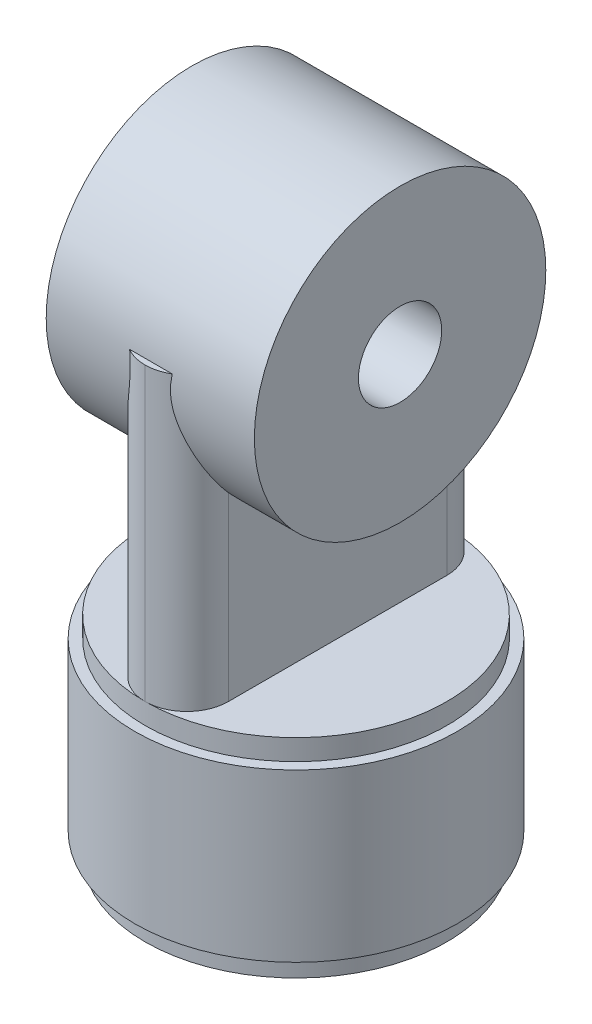
ISO-10303-21;
HEADER;
FILE_DESCRIPTION(('STEP AP214'),'2;1');
FILE_NAME('part.step','',(''),(''),'','','');
FILE_SCHEMA(('AUTOMOTIVE_DESIGN { 1 0 10303 214 1 1 1 1 }'));
ENDSEC;
DATA;
#1=APPLICATION_CONTEXT('core data for automotive mechanical design processes');
#2=APPLICATION_PROTOCOL_DEFINITION('international standard','automotive_design',2000,#1);
#3=PRODUCT_CONTEXT('',#1,'mechanical');
#4=PRODUCT('Part','Part','',(#3));
#5=PRODUCT_RELATED_PRODUCT_CATEGORY('part','',(#4));
#6=PRODUCT_DEFINITION_FORMATION('','',#4);
#7=PRODUCT_DEFINITION_CONTEXT('part definition',#1,'design');
#8=PRODUCT_DEFINITION('design','',#6,#7);
#9=PRODUCT_DEFINITION_SHAPE('','',#8);
#10=(LENGTH_UNIT() NAMED_UNIT(*) SI_UNIT(.MILLI.,.METRE.));
#11=(NAMED_UNIT(*) PLANE_ANGLE_UNIT() SI_UNIT($,.RADIAN.));
#12=(NAMED_UNIT(*) SI_UNIT($,.STERADIAN.) SOLID_ANGLE_UNIT());
#13=UNCERTAINTY_MEASURE_WITH_UNIT(LENGTH_MEASURE(1.E-05),#10,'distance_accuracy_value','');
#14=(GEOMETRIC_REPRESENTATION_CONTEXT(3) GLOBAL_UNCERTAINTY_ASSIGNED_CONTEXT((#13)) GLOBAL_UNIT_ASSIGNED_CONTEXT((#10,
#11,#12)) REPRESENTATION_CONTEXT('',''));
#15=CARTESIAN_POINT('',(0.,0.,0.));
#16=DIRECTION('',(0.,0.,1.));
#17=DIRECTION('',(1.,0.,0.));
#18=AXIS2_PLACEMENT_3D('',#15,#16,#17);
#19=CARTESIAN_POINT('',(2.19715175105949E-05,130.810063129519,-6.0681057722898E-07));
#20=DIRECTION('',(0.,1.,0.));
#21=DIRECTION('',(0.,0.,1.));
#22=AXIS2_PLACEMENT_3D('',#19,#20,#21);
#23=CYLINDRICAL_SURFACE('',#22,9.06059223465878);
#24=CARTESIAN_POINT('',(2.19715175105949E-05,103.065080842823,-6.0681057722898E-07));
#25=DIRECTION('',(0.,1.,0.));
#26=DIRECTION('',(0.,0.,1.));
#27=AXIS2_PLACEMENT_3D('',#24,#25,#26);
#28=CIRCLE('',#27,9.06059223465878);
#29=CARTESIAN_POINT('',(2.19715175105949E-05,103.065080842823,9.0605916278482));
#30=VERTEX_POINT('',#29);
#31=EDGE_CURVE('E254',#30,#30,#28,.T.);
#32=ORIENTED_EDGE('',*,*,#31,.T.);
#33=EDGE_LOOP('',(#32));
#34=FACE_BOUND('',#33,.T.);
#35=CARTESIAN_POINT('',(2.19715175105949E-05,104.315080842823,-6.0681057722898E-07));
#36=DIRECTION('',(0.,1.,0.));
#37=DIRECTION('',(0.,0.,1.));
#38=AXIS2_PLACEMENT_3D('',#35,#36,#37);
#39=CIRCLE('',#38,9.06059223465877);
#40=CARTESIAN_POINT('',(2.19715175123918E-05,104.315080842823,9.0605916278482));
#41=VERTEX_POINT('',#40);
#42=CARTESIAN_POINT('',(2.19715175123918E-05,104.315080842823,-9.06059284146935));
#43=VERTEX_POINT('',#42);
#44=EDGE_CURVE('E258',#41,#43,#39,.T.);
#45=ORIENTED_EDGE('',*,*,#44,.F.);
#46=EDGE_CURVE('E257',#43,#41,#39,.T.);
#47=ORIENTED_EDGE('',*,*,#46,.F.);
#48=EDGE_LOOP('',(#45,#47));
#49=FACE_BOUND('',#48,.T.);
#50=ADVANCED_FACE('F39',(#34,#49),#23,.T.);
#51=CARTESIAN_POINT('',(2.1971517573045E-05,121.815080842823,-6.06810264111393E-07));
#52=DIRECTION('',(0.,1.,0.));
#53=DIRECTION('',(0.,0.,1.));
#54=AXIS2_PLACEMENT_3D('',#51,#52,#53);
#55=PLANE('',#54);
#56=CARTESIAN_POINT('',(2.1971517511896E-05,121.815080842823,6.5605916278482));
#57=DIRECTION('',(0.,1.,0.));
#58=DIRECTION('',(0.,0.,1.));
#59=AXIS2_PLACEMENT_3D('',#56,#57,#58);
#60=CIRCLE('',#59,2.5);
#61=CARTESIAN_POINT('',(-1.27861934600974,121.815080842823,8.70886451114589));
#62=VERTEX_POINT('',#61);
#63=CARTESIAN_POINT('',(2.19715175123918E-05,121.815080842823,9.06059162784815));
#64=VERTEX_POINT('',#63);
#65=EDGE_CURVE('E133',#62,#64,#60,.T.);
#66=ORIENTED_EDGE('',*,*,#65,.T.);
#67=CARTESIAN_POINT('',(2.19715175084265E-05,121.815080842823,6.5605916278482));
#68=DIRECTION('',(0.,1.,0.));
#69=DIRECTION('',(0.,0.,1.));
#70=AXIS2_PLACEMENT_3D('',#67,#68,#69);
#71=CIRCLE('',#70,2.5);
#72=CARTESIAN_POINT('',(1.27866328904476,121.815080842823,8.70886451114589));
#73=VERTEX_POINT('',#72);
#74=EDGE_CURVE('E135',#64,#73,#71,.T.);
#75=ORIENTED_EDGE('',*,*,#74,.T.);
#76=DIRECTION('',(1.,0.,0.));
#77=VECTOR('',#76,1.);
#78=CARTESIAN_POINT('',(-6.24997802848249,121.815080842823,8.70886451114589));
#79=LINE('',#78,#77);
#80=EDGE_CURVE('E111',#73,#62,#79,.F.);
#81=ORIENTED_EDGE('',*,*,#80,.T.);
#82=EDGE_LOOP('',(#66,#75,#81));
#83=FACE_BOUND('',#82,.T.);
#84=ADVANCED_FACE('F263',(#83),#55,.T.);
#85=DIRECTION('',(1.,0.,0.));
#86=VECTOR('',#85,1.);
#87=CARTESIAN_POINT('',(-6.24997802848249,121.815080842823,-8.70886572476704));
#88=LINE('',#87,#86);
#89=CARTESIAN_POINT('',(-1.27861934600974,121.815080842823,-8.70886572476704));
#90=VERTEX_POINT('',#89);
#91=CARTESIAN_POINT('',(1.27866328904476,121.815080842823,-8.70886572476704));
#92=VERTEX_POINT('',#91);
#93=EDGE_CURVE('E208',#90,#92,#88,.T.);
#94=ORIENTED_EDGE('',*,*,#93,.T.);
#95=CARTESIAN_POINT('',(2.19715175084265E-05,121.815080842823,-6.56059284146935));
#96=DIRECTION('',(0.,1.,0.));
#97=DIRECTION('',(0.,0.,1.));
#98=AXIS2_PLACEMENT_3D('',#95,#96,#97);
#99=CIRCLE('',#98,2.5);
#100=CARTESIAN_POINT('',(2.19715175123918E-05,121.815080842823,-9.06059284146934));
#101=VERTEX_POINT('',#100);
#102=EDGE_CURVE('E146',#92,#101,#99,.T.);
#103=ORIENTED_EDGE('',*,*,#102,.T.);
#104=CARTESIAN_POINT('',(2.1971517511896E-05,121.815080842823,-6.56059284146935));
#105=DIRECTION('',(0.,1.,0.));
#106=DIRECTION('',(0.,0.,1.));
#107=AXIS2_PLACEMENT_3D('',#104,#105,#106);
#108=CIRCLE('',#107,2.5);
#109=EDGE_CURVE('E64',#101,#90,#108,.T.);
#110=ORIENTED_EDGE('',*,*,#109,.T.);
#111=EDGE_LOOP('',(#94,#103,#110));
#112=FACE_BOUND('',#111,.T.);
#113=ADVANCED_FACE('F272',(#112),#55,.T.);
#114=CARTESIAN_POINT('',(-9.06057026314126,104.315080842823,-6.0681057722898E-07));
#115=DIRECTION('',(0.,1.,0.));
#116=DIRECTION('',(0.,0.,1.));
#117=AXIS2_PLACEMENT_3D('',#114,#115,#116);
#118=PLANE('',#117);
#119=DIRECTION('',(0.,0.,-1.));
#120=VECTOR('',#119,1.);
#121=CARTESIAN_POINT('',(2.50002197151751,104.315080842823,-8.70886572476704));
#122=LINE('',#121,#120);
#123=CARTESIAN_POINT('',(2.50002197151751,104.315080842823,6.5605916278482));
#124=VERTEX_POINT('',#123);
#125=CARTESIAN_POINT('',(2.50002197151751,104.315080842823,-6.56059284146935));
#126=VERTEX_POINT('',#125);
#127=EDGE_CURVE('E216',#124,#126,#122,.T.);
#128=ORIENTED_EDGE('',*,*,#127,.F.);
#129=CARTESIAN_POINT('',(2.19715175084265E-05,104.315080842823,6.5605916278482));
#130=DIRECTION('',(0.,1.,0.));
#131=DIRECTION('',(0.,0.,1.));
#132=AXIS2_PLACEMENT_3D('',#129,#130,#131);
#133=CIRCLE('',#132,2.5);
#134=EDGE_CURVE('E116',#124,#41,#133,.F.);
#135=ORIENTED_EDGE('',*,*,#134,.T.);
#136=ORIENTED_EDGE('',*,*,#44,.T.);
#137=CARTESIAN_POINT('',(2.19715175084265E-05,104.315080842823,-6.56059284146935));
#138=DIRECTION('',(0.,1.,0.));
#139=DIRECTION('',(0.,0.,1.));
#140=AXIS2_PLACEMENT_3D('',#137,#138,#139);
#141=CIRCLE('',#140,2.5);
#142=EDGE_CURVE('E178',#43,#126,#141,.F.);
#143=ORIENTED_EDGE('',*,*,#142,.T.);
#144=EDGE_LOOP('',(#128,#135,#136,#143));
#145=FACE_BOUND('',#144,.T.);
#146=ADVANCED_FACE('F270',(#145),#118,.T.);
#147=CARTESIAN_POINT('',(2.19715175105949E-05,103.682950843359,-6.0681057722898E-07));
#148=DIRECTION('',(0.,-1.,0.));
#149=DIRECTION('',(0.,0.,-1.));
#150=AXIS2_PLACEMENT_3D('',#147,#148,#149);
#151=PLANE('',#150);
#152=CARTESIAN_POINT('',(2.19715175105949E-05,103.682950843359,-6.0681057722898E-07));
#153=DIRECTION('',(0.,1.,0.));
#154=DIRECTION('',(0.,0.,1.));
#155=AXIS2_PLACEMENT_3D('',#152,#153,#154);
#156=CIRCLE('',#155,8.);
#157=CARTESIAN_POINT('',(2.19715175105949E-05,103.682950843359,7.99999939318942));
#158=VERTEX_POINT('',#157);
#159=EDGE_CURVE('E221',#158,#158,#156,.T.);
#160=ORIENTED_EDGE('',*,*,#159,.F.);
#161=EDGE_LOOP('',(#160));
#162=FACE_BOUND('',#161,.T.);
#163=ADVANCED_FACE('F164',(#162),#151,.T.);
#164=DIRECTION('',(0.,0.,1.));
#165=VECTOR('',#164,1.);
#166=CARTESIAN_POINT('',(-2.49997802848249,104.315080842823,-8.70886572476704));
#167=LINE('',#166,#165);
#168=CARTESIAN_POINT('',(-2.49997802848249,104.315080842823,-6.56059284146935));
#169=VERTEX_POINT('',#168);
#170=CARTESIAN_POINT('',(-2.49997802848249,104.315080842823,6.5605916278482));
#171=VERTEX_POINT('',#170);
#172=EDGE_CURVE('E214',#169,#171,#167,.T.);
#173=ORIENTED_EDGE('',*,*,#172,.F.);
#174=CARTESIAN_POINT('',(2.1971517511896E-05,104.315080842823,-6.56059284146935));
#175=DIRECTION('',(0.,1.,0.));
#176=DIRECTION('',(0.,0.,1.));
#177=AXIS2_PLACEMENT_3D('',#174,#175,#176);
#178=CIRCLE('',#177,2.5);
#179=EDGE_CURVE('E49',#169,#43,#178,.F.);
#180=ORIENTED_EDGE('',*,*,#179,.T.);
#181=ORIENTED_EDGE('',*,*,#46,.T.);
#182=CARTESIAN_POINT('',(2.1971517511896E-05,104.315080842823,6.5605916278482));
#183=DIRECTION('',(0.,1.,0.));
#184=DIRECTION('',(0.,0.,1.));
#185=AXIS2_PLACEMENT_3D('',#182,#183,#184);
#186=CIRCLE('',#185,2.5);
#187=EDGE_CURVE('E115',#41,#171,#186,.F.);
#188=ORIENTED_EDGE('',*,*,#187,.T.);
#189=EDGE_LOOP('',(#173,#180,#181,#188));
#190=FACE_BOUND('',#189,.T.);
#191=ADVANCED_FACE('F266',(#190),#118,.T.);
#192=CARTESIAN_POINT('',(-9.06057026314127,103.065080842823,-6.0681057722898E-07));
#193=DIRECTION('',(0.,1.,0.));
#194=DIRECTION('',(0.,0.,1.));
#195=AXIS2_PLACEMENT_3D('',#192,#193,#194);
#196=PLANE('',#195);
#197=CARTESIAN_POINT('',(2.19715175105949E-05,103.065080842823,-6.0681057722898E-07));
#198=DIRECTION('',(0.,1.,0.));
#199=DIRECTION('',(0.,0.,1.));
#200=AXIS2_PLACEMENT_3D('',#197,#198,#199);
#201=CIRCLE('',#200,9.67634385878391);
#202=CARTESIAN_POINT('',(2.19715175105949E-05,103.065080842823,9.67634325197334));
#203=VERTEX_POINT('',#202);
#204=EDGE_CURVE('E251',#203,#203,#201,.T.);
#205=ORIENTED_EDGE('',*,*,#204,.T.);
#206=EDGE_LOOP('',(#205));
#207=FACE_BOUND('',#206,.T.);
#208=ORIENTED_EDGE('',*,*,#31,.F.);
#209=EDGE_LOOP('',(#208));
#210=FACE_BOUND('',#209,.T.);
#211=ADVANCED_FACE('F280',(#207,#210),#196,.T.);
#212=CARTESIAN_POINT('',(2.19715175105949E-05,130.810063129519,-6.0681057722898E-07));
#213=DIRECTION('',(0.,1.,0.));
#214=DIRECTION('',(0.,0.,1.));
#215=AXIS2_PLACEMENT_3D('',#212,#213,#214);
#216=CYLINDRICAL_SURFACE('',#215,9.67634385878391);
#217=CARTESIAN_POINT('',(2.19715175105949E-05,93.0650808428226,-6.0681057722898E-07));
#218=DIRECTION('',(0.,1.,0.));
#219=DIRECTION('',(0.,0.,1.));
#220=AXIS2_PLACEMENT_3D('',#217,#218,#219);
#221=CIRCLE('',#220,9.67634385878391);
#222=CARTESIAN_POINT('',(2.19715175105949E-05,93.0650808428226,9.67634325197334));
#223=VERTEX_POINT('',#222);
#224=EDGE_CURVE('E248',#223,#223,#221,.T.);
#225=ORIENTED_EDGE('',*,*,#224,.T.);
#226=EDGE_LOOP('',(#225));
#227=FACE_BOUND('',#226,.T.);
#228=ORIENTED_EDGE('',*,*,#204,.F.);
#229=EDGE_LOOP('',(#228));
#230=FACE_BOUND('',#229,.T.);
#231=ADVANCED_FACE('F289',(#227,#230),#216,.T.);
#232=CARTESIAN_POINT('',(-9.06057026314126,93.0650808428226,-6.0681057722898E-07));
#233=DIRECTION('',(0.,-1.,0.));
#234=DIRECTION('',(0.,0.,-1.));
#235=AXIS2_PLACEMENT_3D('',#232,#233,#234);
#236=PLANE('',#235);
#237=CARTESIAN_POINT('',(2.19715175105949E-05,93.0650808428226,-6.0681057722898E-07));
#238=DIRECTION('',(0.,1.,0.));
#239=DIRECTION('',(0.,0.,1.));
#240=AXIS2_PLACEMENT_3D('',#237,#238,#239);
#241=CIRCLE('',#240,9.06059223465877);
#242=CARTESIAN_POINT('',(2.19715175105949E-05,93.0650808428226,9.0605916278482));
#243=VERTEX_POINT('',#242);
#244=EDGE_CURVE('E245',#243,#243,#241,.T.);
#245=ORIENTED_EDGE('',*,*,#244,.T.);
#246=EDGE_LOOP('',(#245));
#247=FACE_BOUND('',#246,.T.);
#248=ORIENTED_EDGE('',*,*,#224,.F.);
#249=EDGE_LOOP('',(#248));
#250=FACE_BOUND('',#249,.T.);
#251=ADVANCED_FACE('F293',(#247,#250),#236,.T.);
#252=CARTESIAN_POINT('',(2.19715175105949E-05,130.810063129519,-6.0681057722898E-07));
#253=DIRECTION('',(0.,1.,0.));
#254=DIRECTION('',(0.,0.,1.));
#255=AXIS2_PLACEMENT_3D('',#252,#253,#254);
#256=CYLINDRICAL_SURFACE('',#255,9.06059223465877);
#257=CARTESIAN_POINT('',(2.19715175105949E-05,91.8150808428226,-6.0681057722898E-07));
#258=DIRECTION('',(0.,1.,0.));
#259=DIRECTION('',(0.,0.,1.));
#260=AXIS2_PLACEMENT_3D('',#257,#258,#259);
#261=CIRCLE('',#260,9.06059223465877);
#262=CARTESIAN_POINT('',(2.19715175105949E-05,91.8150808428226,9.0605916278482));
#263=VERTEX_POINT('',#262);
#264=EDGE_CURVE('E242',#263,#263,#261,.T.);
#265=ORIENTED_EDGE('',*,*,#264,.T.);
#266=EDGE_LOOP('',(#265));
#267=FACE_BOUND('',#266,.T.);
#268=ORIENTED_EDGE('',*,*,#244,.F.);
#269=EDGE_LOOP('',(#268));
#270=FACE_BOUND('',#269,.T.);
#271=ADVANCED_FACE('F297',(#267,#270),#256,.T.);
#272=CARTESIAN_POINT('',(-1.24997802848248,91.8150808428226,-6.0681057722898E-07));
#273=DIRECTION('',(0.,-1.,0.));
#274=DIRECTION('',(0.,0.,-1.));
#275=AXIS2_PLACEMENT_3D('',#272,#273,#274);
#276=PLANE('',#275);
#277=CARTESIAN_POINT('',(2.19715175105949E-05,91.8150808428226,-6.0681057722898E-07));
#278=DIRECTION('',(0.,1.,0.));
#279=DIRECTION('',(0.,0.,1.));
#280=AXIS2_PLACEMENT_3D('',#277,#278,#279);
#281=CIRCLE('',#280,1.24999999999999);
#282=CARTESIAN_POINT('',(2.19715175105949E-05,91.8150808428226,1.24999939318942));
#283=VERTEX_POINT('',#282);
#284=EDGE_CURVE('E239',#283,#283,#281,.T.);
#285=ORIENTED_EDGE('',*,*,#284,.T.);
#286=EDGE_LOOP('',(#285));
#287=FACE_BOUND('',#286,.T.);
#288=ORIENTED_EDGE('',*,*,#264,.F.);
#289=EDGE_LOOP('',(#288));
#290=FACE_BOUND('',#289,.T.);
#291=ADVANCED_FACE('F301',(#287,#290),#276,.T.);
#292=CARTESIAN_POINT('',(2.19715175105949E-05,130.810063129519,-6.0681057722898E-07));
#293=DIRECTION('',(0.,1.,0.));
#294=DIRECTION('',(0.,0.,1.));
#295=AXIS2_PLACEMENT_3D('',#292,#293,#294);
#296=CYLINDRICAL_SURFACE('',#295,1.25);
#297=CARTESIAN_POINT('',(2.19715175105949E-05,94.8129625902348,-6.0681057722898E-07));
#298=DIRECTION('',(0.,1.,0.));
#299=DIRECTION('',(0.,0.,1.));
#300=AXIS2_PLACEMENT_3D('',#297,#298,#299);
#301=CIRCLE('',#300,1.25);
#302=CARTESIAN_POINT('',(2.19715175105949E-05,94.8129625902348,1.24999939318942));
#303=VERTEX_POINT('',#302);
#304=EDGE_CURVE('E236',#303,#303,#301,.T.);
#305=ORIENTED_EDGE('',*,*,#304,.T.);
#306=EDGE_LOOP('',(#305));
#307=FACE_BOUND('',#306,.T.);
#308=ORIENTED_EDGE('',*,*,#284,.F.);
#309=EDGE_LOOP('',(#308));
#310=FACE_BOUND('',#309,.T.);
#311=ADVANCED_FACE('F305',(#307,#310),#296,.F.);
#312=CARTESIAN_POINT('',(-6.24997802848249,94.8129625902348,-6.0681057722898E-07));
#313=DIRECTION('',(0.,1.,0.));
#314=DIRECTION('',(0.,0.,1.));
#315=AXIS2_PLACEMENT_3D('',#312,#313,#314);
#316=PLANE('',#315);
#317=CARTESIAN_POINT('',(2.19715175105949E-05,94.8129625902348,-6.0681057722898E-07));
#318=DIRECTION('',(0.,1.,0.));
#319=DIRECTION('',(0.,0.,1.));
#320=AXIS2_PLACEMENT_3D('',#317,#318,#319);
#321=CIRCLE('',#320,6.25);
#322=CARTESIAN_POINT('',(2.19715175105949E-05,94.8129625902348,6.24999939318942));
#323=VERTEX_POINT('',#322);
#324=EDGE_CURVE('E233',#323,#323,#321,.T.);
#325=ORIENTED_EDGE('',*,*,#324,.T.);
#326=EDGE_LOOP('',(#325));
#327=FACE_BOUND('',#326,.T.);
#328=ORIENTED_EDGE('',*,*,#304,.F.);
#329=EDGE_LOOP('',(#328));
#330=FACE_BOUND('',#329,.T.);
#331=ADVANCED_FACE('F309',(#327,#330),#316,.T.);
#332=CARTESIAN_POINT('',(2.19715175105949E-05,130.810063129519,-6.0681057722898E-07));
#333=DIRECTION('',(0.,1.,0.));
#334=DIRECTION('',(0.,0.,1.));
#335=AXIS2_PLACEMENT_3D('',#332,#333,#334);
#336=CYLINDRICAL_SURFACE('',#335,6.25);
#337=CARTESIAN_POINT('',(2.19715175105949E-05,95.5650808428226,-6.0681057722898E-07));
#338=DIRECTION('',(0.,1.,0.));
#339=DIRECTION('',(0.,0.,1.));
#340=AXIS2_PLACEMENT_3D('',#337,#338,#339);
#341=CIRCLE('',#340,6.25);
#342=CARTESIAN_POINT('',(2.19715175105949E-05,95.5650808428226,6.24999939318942));
#343=VERTEX_POINT('',#342);
#344=EDGE_CURVE('E230',#343,#343,#341,.T.);
#345=ORIENTED_EDGE('',*,*,#344,.T.);
#346=EDGE_LOOP('',(#345));
#347=FACE_BOUND('',#346,.T.);
#348=ORIENTED_EDGE('',*,*,#324,.F.);
#349=EDGE_LOOP('',(#348));
#350=FACE_BOUND('',#349,.T.);
#351=ADVANCED_FACE('F313',(#347,#350),#336,.F.);
#352=CARTESIAN_POINT('',(-7.49997802848249,95.5650808428226,-6.0681057722898E-07));
#353=DIRECTION('',(0.,1.,0.));
#354=DIRECTION('',(0.,0.,1.));
#355=AXIS2_PLACEMENT_3D('',#352,#353,#354);
#356=PLANE('',#355);
#357=CARTESIAN_POINT('',(2.19715175105949E-05,95.5650808428226,-6.0681057722898E-07));
#358=DIRECTION('',(0.,1.,0.));
#359=DIRECTION('',(0.,0.,1.));
#360=AXIS2_PLACEMENT_3D('',#357,#358,#359);
#361=CIRCLE('',#360,7.5);
#362=CARTESIAN_POINT('',(2.19715175105949E-05,95.5650808428226,7.49999939318942));
#363=VERTEX_POINT('',#362);
#364=EDGE_CURVE('E227',#363,#363,#361,.T.);
#365=ORIENTED_EDGE('',*,*,#364,.T.);
#366=EDGE_LOOP('',(#365));
#367=FACE_BOUND('',#366,.T.);
#368=ORIENTED_EDGE('',*,*,#344,.F.);
#369=EDGE_LOOP('',(#368));
#370=FACE_BOUND('',#369,.T.);
#371=ADVANCED_FACE('F317',(#367,#370),#356,.T.);
#372=CARTESIAN_POINT('',(2.19715175105949E-05,96.0650808428226,-6.0681057722898E-07));
#373=DIRECTION('',(0.,1.,0.));
#374=DIRECTION('',(0.,0.,1.));
#375=AXIS2_PLACEMENT_3D('',#372,#373,#374);
#376=TOROIDAL_SURFACE('',#375,7.5,0.5);
#377=CARTESIAN_POINT('',(2.19715175105949E-05,96.0650808428226,-6.0681057722898E-07));
#378=DIRECTION('',(0.,1.,0.));
#379=DIRECTION('',(0.,0.,1.));
#380=AXIS2_PLACEMENT_3D('',#377,#378,#379);
#381=CIRCLE('',#380,8.);
#382=CARTESIAN_POINT('',(2.19715175105949E-05,96.0650808428226,7.99999939318942));
#383=VERTEX_POINT('',#382);
#384=EDGE_CURVE('E224',#383,#383,#381,.T.);
#385=ORIENTED_EDGE('',*,*,#384,.T.);
#386=EDGE_LOOP('',(#385));
#387=FACE_BOUND('',#386,.T.);
#388=ORIENTED_EDGE('',*,*,#364,.F.);
#389=EDGE_LOOP('',(#388));
#390=FACE_BOUND('',#389,.T.);
#391=ADVANCED_FACE('F321',(#387,#390),#376,.F.);
#392=CARTESIAN_POINT('',(2.19715175105949E-05,130.810063129519,-6.0681057722898E-07));
#393=DIRECTION('',(0.,1.,0.));
#394=DIRECTION('',(0.,0.,1.));
#395=AXIS2_PLACEMENT_3D('',#392,#393,#394);
#396=CYLINDRICAL_SURFACE('',#395,8.);
#397=ORIENTED_EDGE('',*,*,#159,.T.);
#398=EDGE_LOOP('',(#397));
#399=FACE_BOUND('',#398,.T.);
#400=ORIENTED_EDGE('',*,*,#384,.F.);
#401=EDGE_LOOP('',(#400));
#402=FACE_BOUND('',#401,.T.);
#403=ADVANCED_FACE('F325',(#399,#402),#396,.F.);
#404=CARTESIAN_POINT('',(-2.49997802848249,121.815080842823,-8.70886572476704));
#405=DIRECTION('',(1.,0.,0.));
#406=DIRECTION('',(0.,0.,-1.));
#407=AXIS2_PLACEMENT_3D('',#404,#405,#406);
#408=PLANE('',#407);
#409=ORIENTED_EDGE('',*,*,#172,.T.);
#410=DIRECTION('',(0.,-1.,0.));
#411=VECTOR('',#410,1.);
#412=CARTESIAN_POINT('',(-2.49997802848249,120.120184554266,6.5605916278482));
#413=LINE('',#412,#411);
#414=CARTESIAN_POINT('',(-2.49997802848249,115.177889221452,6.5605916278482));
#415=VERTEX_POINT('',#414);
#416=EDGE_CURVE('E143',#171,#415,#413,.F.);
#417=ORIENTED_EDGE('',*,*,#416,.T.);
#418=CARTESIAN_POINT('',(-2.49997802848249,120.967632698544,-6.0681057722898E-07));
#419=DIRECTION('',(1.,0.,0.));
#420=DIRECTION('',(0.,0.,-1.));
#421=AXIS2_PLACEMENT_3D('',#418,#419,#420);
#422=CIRCLE('',#421,8.75);
#423=CARTESIAN_POINT('',(-2.49997802848249,115.177889221452,-6.56059284146935));
#424=VERTEX_POINT('',#423);
#425=EDGE_CURVE('E127',#424,#415,#422,.F.);
#426=ORIENTED_EDGE('',*,*,#425,.F.);
#427=DIRECTION('',(0.,-1.,0.));
#428=VECTOR('',#427,1.);
#429=CARTESIAN_POINT('',(-2.49997802848249,104.315080842823,-6.56059284146935));
#430=LINE('',#429,#428);
#431=EDGE_CURVE('E141',#424,#169,#430,.T.);
#432=ORIENTED_EDGE('',*,*,#431,.T.);
#433=EDGE_LOOP('',(#409,#417,#426,#432));
#434=FACE_BOUND('',#433,.T.);
#435=ADVANCED_FACE('F211',(#434),#408,.F.);
#436=CARTESIAN_POINT('',(2.50002197151751,121.815080842823,-8.70886572476704));
#437=DIRECTION('',(-1.,0.,0.));
#438=DIRECTION('',(0.,0.,1.));
#439=AXIS2_PLACEMENT_3D('',#436,#437,#438);
#440=PLANE('',#439);
#441=CARTESIAN_POINT('',(2.50002197151751,120.967632698544,-6.0681057722898E-07));
#442=DIRECTION('',(-1.,0.,0.));
#443=DIRECTION('',(0.,0.,1.));
#444=AXIS2_PLACEMENT_3D('',#441,#442,#443);
#445=CIRCLE('',#444,8.75);
#446=CARTESIAN_POINT('',(2.50002197151751,115.177889221452,6.5605916278482));
#447=VERTEX_POINT('',#446);
#448=CARTESIAN_POINT('',(2.50002197151751,115.177889221452,-6.56059284146935));
#449=VERTEX_POINT('',#448);
#450=EDGE_CURVE('E109',#447,#449,#445,.F.);
#451=ORIENTED_EDGE('',*,*,#450,.F.);
#452=DIRECTION('',(0.,-1.,0.));
#453=VECTOR('',#452,1.);
#454=CARTESIAN_POINT('',(2.50002197151751,104.315080842823,6.5605916278482));
#455=LINE('',#454,#453);
#456=EDGE_CURVE('E123',#447,#124,#455,.T.);
#457=ORIENTED_EDGE('',*,*,#456,.T.);
#458=ORIENTED_EDGE('',*,*,#127,.T.);
#459=DIRECTION('',(0.,-1.,0.));
#460=VECTOR('',#459,1.);
#461=CARTESIAN_POINT('',(2.50002197151751,120.120184554266,-6.56059284146935));
#462=LINE('',#461,#460);
#463=EDGE_CURVE('E126',#126,#449,#462,.F.);
#464=ORIENTED_EDGE('',*,*,#463,.T.);
#465=EDGE_LOOP('',(#451,#457,#458,#464));
#466=FACE_BOUND('',#465,.T.);
#467=ADVANCED_FACE('F121',(#466),#440,.F.);
#468=CARTESIAN_POINT('',(-6.24997802848249,120.967632698544,-6.0681057722898E-07));
#469=DIRECTION('',(1.,0.,0.));
#470=DIRECTION('',(0.,0.,-1.));
#471=AXIS2_PLACEMENT_3D('',#468,#469,#470);
#472=CYLINDRICAL_SURFACE('',#471,8.75);
#473=ORIENTED_EDGE('',*,*,#80,.F.);
#474=CARTESIAN_POINT('',(1.27866328904476,121.815080842823,8.70886451114589));
#475=CARTESIAN_POINT('',(1.26150703257347,121.710550839917,8.71904538902356));
#476=CARTESIAN_POINT('',(1.24709243268614,121.605340889017,8.72737436995917));
#477=CARTESIAN_POINT('',(1.22449039870761,121.394009454449,8.74024369353909));
#478=CARTESIAN_POINT('',(1.2163042423246,121.287887788264,8.744783258838));
#479=CARTESIAN_POINT('',(1.20699172598372,121.07706122034,8.74993973790576));
#480=CARTESIAN_POINT('',(1.2057458641021,120.97236350907,8.7506230534774));
#481=CARTESIAN_POINT('',(1.21006993790728,120.763188066516,8.74823610686625));
#482=CARTESIAN_POINT('',(1.2156383427716,120.658710291104,8.74516668773402));
#483=CARTESIAN_POINT('',(1.2383122739855,120.389374738023,8.73243576350212));
#484=CARTESIAN_POINT('',(1.2602693285585,120.225048042336,8.71996356335069));
#485=CARTESIAN_POINT('',(1.3165597617011,119.899417956044,8.68609754923238));
#486=CARTESIAN_POINT('',(1.3509071083789,119.738118194603,8.66469366190422));
#487=CARTESIAN_POINT('',(1.42811949264967,119.41713827578,8.61308141583737));
#488=CARTESIAN_POINT('',(1.47107425707842,119.257495576774,8.58277859564742));
#489=CARTESIAN_POINT('',(1.56161038969089,118.941478398993,8.51371475592465));
#490=CARTESIAN_POINT('',(1.60919055699109,118.785103084655,8.4749559285727));
#491=CARTESIAN_POINT('',(1.73112300385255,118.395434834299,8.36693853737342));
#492=CARTESIAN_POINT('',(1.80664529796582,118.163997052989,8.29225164534961));
#493=CARTESIAN_POINT('',(1.9545287861612,117.707073681455,8.12345739262519));
#494=CARTESIAN_POINT('',(2.02688786461134,117.4815921136,8.02933726823139));
#495=CARTESIAN_POINT('',(2.16181428003195,117.039030308484,7.82225685672544));
#496=CARTESIAN_POINT('',(2.22446491471983,116.821892197558,7.7094762577917));
#497=CARTESIAN_POINT('',(2.33483842072995,116.395210485303,7.4643038371813));
#498=CARTESIAN_POINT('',(2.38258149443693,116.185656949226,7.33193891764383));
#499=CARTESIAN_POINT('',(2.44449573400818,115.842400578723,7.09386164888935));
#500=CARTESIAN_POINT('',(2.46453239790909,115.706121957511,6.99341073124019));
#501=CARTESIAN_POINT('',(2.48535712474847,115.505309135044,6.83613934573699));
#502=CARTESIAN_POINT('',(2.49076244991596,115.438785346256,6.78245153930781));
#503=CARTESIAN_POINT('',(2.49809358458303,115.307197614692,6.6730278618254));
#504=CARTESIAN_POINT('',(2.5000177522008,115.242134375063,6.61729103699443));
#505=CARTESIAN_POINT('',(2.50002197151751,115.177889221452,6.5605916278482));
#506=B_SPLINE_CURVE_WITH_KNOTS('',3,(#474,#475,#476,#477,#478,#479,#480,#481,#482,#483,#484,
#485,#486,#487,#488,#489,#490,#491,#492,#493,#494,#495,#496,#497,#498,#499,#500,#501,#502,#503,
#504,#505),.UNSPECIFIED.,.F.,.F.,(4,2,2,2,2,2,2,2,2,2,2,2,2,2,2,4),(0.,0.319271040867784,
0.638607559622306,0.952428157329494,1.26617826829766,1.76397033380798,2.26232534449227,
2.76617434894583,3.26989288775337,4.03298508704667,4.79658008667007,5.55320970660148,
6.30880946400289,6.81957286020573,7.07644402380242,7.33343630867609),.UNSPECIFIED.);
#507=EDGE_CURVE('E105',#73,#447,#506,.T.);
#508=ORIENTED_EDGE('',*,*,#507,.T.);
#509=ORIENTED_EDGE('',*,*,#450,.T.);
#510=CARTESIAN_POINT('',(2.50002197151751,115.177889221452,-6.56059284146935));
#511=CARTESIAN_POINT('',(2.50001891961953,115.237445363057,-6.61315313170282));
#512=CARTESIAN_POINT('',(2.49836485114013,115.297704014236,-6.66488696110784));
#513=CARTESIAN_POINT('',(2.49204075251503,115.41949406742,-6.7666058193505));
#514=CARTESIAN_POINT('',(2.48737170138551,115.481025050001,-6.81659141031869));
#515=CARTESIAN_POINT('',(2.46929449621143,115.667126039202,-6.96362637056656));
#516=CARTESIAN_POINT('',(2.45181385710471,115.793455081379,-7.05797524167562));
#517=CARTESIAN_POINT('',(2.40821913866391,116.048716380623,-7.2381602979014));
#518=CARTESIAN_POINT('',(2.38218845826318,116.17761261549,-7.32406869130579));
#519=CARTESIAN_POINT('',(2.32315628315903,116.438673196923,-7.48831313829099));
#520=CARTESIAN_POINT('',(2.29015053703906,116.570839493067,-7.56664453092468));
#521=CARTESIAN_POINT('',(2.19744814859438,116.917489265755,-7.76005090115284));
#522=CARTESIAN_POINT('',(2.13355780557357,117.134146265834,-7.86924572185594));
#523=CARTESIAN_POINT('',(1.99766683469561,117.573643698668,-8.06855957385786));
#524=CARTESIAN_POINT('',(1.92566098569901,117.7964880418,-8.15866621614171));
#525=CARTESIAN_POINT('',(1.7789914427082,118.249134305692,-8.32047654484147));
#526=CARTESIAN_POINT('',(1.70431748677761,118.478962430357,-8.39209787907028));
#527=CARTESIAN_POINT('',(1.59613228108453,118.82853717415,-8.48535654672561));
#528=CARTESIAN_POINT('',(1.56071911579067,118.945828396014,-8.5140734752973));
#529=CARTESIAN_POINT('',(1.49238661372399,119.18218656209,-8.56676039100951));
#530=CARTESIAN_POINT('',(1.45946785202383,119.301253908251,-8.59072928555738));
#531=CARTESIAN_POINT('',(1.3601549424599,119.686371086927,-8.65986543902215));
#532=CARTESIAN_POINT('',(1.30128602303873,119.956450053646,-8.69572210286042));
#533=CARTESIAN_POINT('',(1.24199251807143,120.366507612698,-8.73039679330817));
#534=CARTESIAN_POINT('',(1.22706482981673,120.50358869376,-8.73877323389427));
#535=CARTESIAN_POINT('',(1.20865973564387,120.77873279902,-8.74904271705933));
#536=CARTESIAN_POINT('',(1.20517587331218,120.916795225478,-8.75093941542374));
#537=CARTESIAN_POINT('',(1.20995186334881,121.181899546943,-8.748301914675));
#538=CARTESIAN_POINT('',(1.2173192723842,121.308963291298,-8.74425648754116));
#539=CARTESIAN_POINT('',(1.23533162716134,121.499047024728,-8.73408147987332));
#540=CARTESIAN_POINT('',(1.24253159397351,121.562533020653,-8.72998480738547));
#541=CARTESIAN_POINT('',(1.25905663086452,121.689113089584,-8.72043593755534));
#542=CARTESIAN_POINT('',(1.26838125957446,121.752207241198,-8.71498402172461));
#543=CARTESIAN_POINT('',(1.278663289045,121.815080842823,-8.70886572476704));
#544=B_SPLINE_CURVE_WITH_KNOTS('',3,(#510,#511,#512,#513,#514,#515,#516,#517,#518,#519,#520,
#521,#522,#523,#524,#525,#526,#527,#528,#529,#530,#531,#532,#533,#534,#535,#536,#537,#538,#539,
#540,#541,#542,#543),.UNSPECIFIED.,.F.,.F.,(4,2,2,2,2,2,2,2,2,2,2,2,2,2,2,2,4),(0.,
0.23823942909357,0.476401536665596,0.951725538400149,1.42254437377345,1.89365101290562,
2.64516050189752,3.39715626716608,4.1524465026146,4.52984503638366,4.90733031449439,
5.7402133140002,6.15412328521798,6.5677996952676,6.9492968966235,7.14132580989255,
7.33331486814192),.UNSPECIFIED.);
#545=EDGE_CURVE('E57',#449,#92,#544,.T.);
#546=ORIENTED_EDGE('',*,*,#545,.T.);
#547=ORIENTED_EDGE('',*,*,#93,.F.);
#548=CARTESIAN_POINT('',(-1.27861934600974,121.815080842823,-8.70886572476704));
#549=CARTESIAN_POINT('',(-1.26146308953845,121.710550839917,-8.71904660264471));
#550=CARTESIAN_POINT('',(-1.24704848965112,121.605340889017,-8.72737558358032));
#551=CARTESIAN_POINT('',(-1.22444645567259,121.394009454449,-8.74024490716024));
#552=CARTESIAN_POINT('',(-1.21626029928958,121.287887788264,-8.74478447245916));
#553=CARTESIAN_POINT('',(-1.20694778294869,121.07706122034,-8.74994095152691));
#554=CARTESIAN_POINT('',(-1.20570192106708,120.97236350907,-8.75062426709856));
#555=CARTESIAN_POINT('',(-1.21002599487226,120.763188066516,-8.74823732048741));
#556=CARTESIAN_POINT('',(-1.21559439973658,120.658710291104,-8.74516790135518));
#557=CARTESIAN_POINT('',(-1.23826833095047,120.389374738023,-8.73243697712328));
#558=CARTESIAN_POINT('',(-1.26022538552348,120.225048042336,-8.71996477697184));
#559=CARTESIAN_POINT('',(-1.31651581866608,119.899417956044,-8.68609876285353));
#560=CARTESIAN_POINT('',(-1.35086316534388,119.738118194603,-8.66469487552538));
#561=CARTESIAN_POINT('',(-1.42807554961464,119.41713827578,-8.61308262945853));
#562=CARTESIAN_POINT('',(-1.47103031404339,119.257495576774,-8.58277980926858));
#563=CARTESIAN_POINT('',(-1.56156644665586,118.941478398993,-8.51371596954582));
#564=CARTESIAN_POINT('',(-1.60914661395606,118.785103084656,-8.47495714219386));
#565=CARTESIAN_POINT('',(-1.73107906081753,118.395434834299,-8.36693975099458));
#566=CARTESIAN_POINT('',(-1.8066013549308,118.163997052989,-8.29225285897077));
#567=CARTESIAN_POINT('',(-1.95448484312617,117.707073681455,-8.12345860624635));
#568=CARTESIAN_POINT('',(-2.02684392157632,117.4815921136,-8.02933848185254));
#569=CARTESIAN_POINT('',(-2.16177033699693,117.039030308484,-7.82225807034659));
#570=CARTESIAN_POINT('',(-2.22442097168481,116.821892197558,-7.70947747141285));
#571=CARTESIAN_POINT('',(-2.33479447769493,116.395210485303,-7.46430505080245));
#572=CARTESIAN_POINT('',(-2.38253755140191,116.185656949226,-7.33194013126499));
#573=CARTESIAN_POINT('',(-2.44445179097315,115.842400578723,-7.09386286251051));
#574=CARTESIAN_POINT('',(-2.46448845487407,115.706121957511,-6.99341194486134));
#575=CARTESIAN_POINT('',(-2.48531318171345,115.505309135044,-6.83614055935815));
#576=CARTESIAN_POINT('',(-2.49071850688094,115.438785346256,-6.78245275292897));
#577=CARTESIAN_POINT('',(-2.49804964154801,115.307197614692,-6.67302907544656));
#578=CARTESIAN_POINT('',(-2.49997380916578,115.242134375063,-6.61729225061558));
#579=CARTESIAN_POINT('',(-2.49997802848249,115.177889221452,-6.56059284146935));
#580=B_SPLINE_CURVE_WITH_KNOTS('',3,(#548,#549,#550,#551,#552,#553,#554,#555,#556,#557,#558,
#559,#560,#561,#562,#563,#564,#565,#566,#567,#568,#569,#570,#571,#572,#573,#574,#575,#576,#577,
#578,#579),.UNSPECIFIED.,.F.,.F.,(4,2,2,2,2,2,2,2,2,2,2,2,2,2,2,4),(0.,0.319271040867784,
0.638607559622306,0.95242815732948,1.26617826829766,1.76397033380798,2.26232534449225,
2.7661743489458,3.26989288775336,4.03298508704666,4.79658008667007,5.55320970660148,
6.30880946400289,6.81957286020573,7.07644402380242,7.33343630867609),.UNSPECIFIED.);
#581=EDGE_CURVE('E11',#90,#424,#580,.T.);
#582=ORIENTED_EDGE('',*,*,#581,.T.);
#583=ORIENTED_EDGE('',*,*,#425,.T.);
#584=CARTESIAN_POINT('',(-2.49997802848249,115.177889221452,6.5605916278482));
#585=CARTESIAN_POINT('',(-2.49997497658451,115.237445363057,6.61315191808167));
#586=CARTESIAN_POINT('',(-2.49832090810511,115.297704014236,6.66488574748669));
#587=CARTESIAN_POINT('',(-2.49199680948001,115.41949406742,6.76660460572935));
#588=CARTESIAN_POINT('',(-2.48732775835049,115.481025050001,6.81659019669754));
#589=CARTESIAN_POINT('',(-2.46925055317641,115.667126039202,6.96362515694541));
#590=CARTESIAN_POINT('',(-2.45176991406969,115.793455081379,7.05797402805447));
#591=CARTESIAN_POINT('',(-2.40817519562889,116.048716380623,7.23815908428025));
#592=CARTESIAN_POINT('',(-2.38214451522816,116.17761261549,7.32406747768463));
#593=CARTESIAN_POINT('',(-2.32311234012401,116.438673196923,7.48831192466984));
#594=CARTESIAN_POINT('',(-2.29010659400404,116.570839493067,7.56664331730352));
#595=CARTESIAN_POINT('',(-2.19740420555936,116.917489265755,7.76004968753169));
#596=CARTESIAN_POINT('',(-2.13351386253855,117.134146265834,7.86924450823479));
#597=CARTESIAN_POINT('',(-1.99762289166059,117.573643698668,8.06855836023671));
#598=CARTESIAN_POINT('',(-1.92561704266399,117.7964880418,8.15866500252055));
#599=CARTESIAN_POINT('',(-1.77894749967318,118.249134305692,8.32047533122031));
#600=CARTESIAN_POINT('',(-1.70427354374259,118.478962430357,8.39209666544912));
#601=CARTESIAN_POINT('',(-1.59608833804951,118.82853717415,8.48535533310446));
#602=CARTESIAN_POINT('',(-1.56067517275565,118.945828396014,8.51407226167614));
#603=CARTESIAN_POINT('',(-1.49234267068897,119.18218656209,8.56675917738836));
#604=CARTESIAN_POINT('',(-1.45942390898881,119.301253908251,8.59072807193623));
#605=CARTESIAN_POINT('',(-1.36011099942488,119.686371086927,8.659864225401));
#606=CARTESIAN_POINT('',(-1.30124208000371,119.956450053646,8.69572088923926));
#607=CARTESIAN_POINT('',(-1.24194857503641,120.366507612698,8.73039557968702));
#608=CARTESIAN_POINT('',(-1.22702088678171,120.50358869376,8.73877202027312));
#609=CARTESIAN_POINT('',(-1.20861579260885,120.77873279902,8.74904150343817));
#610=CARTESIAN_POINT('',(-1.20513193027716,120.916795225478,8.75093820180258));
#611=CARTESIAN_POINT('',(-1.20990792031379,121.181899546943,8.74830070105384));
#612=CARTESIAN_POINT('',(-1.21727532934918,121.308963291298,8.74425527392));
#613=CARTESIAN_POINT('',(-1.23528768412632,121.499047024728,8.73408026625217));
#614=CARTESIAN_POINT('',(-1.24248765093849,121.562533020653,8.72998359376431));
#615=CARTESIAN_POINT('',(-1.2590126878295,121.689113089584,8.72043472393418));
#616=CARTESIAN_POINT('',(-1.26833731653944,121.752207241198,8.71498280810345));
#617=CARTESIAN_POINT('',(-1.27861934600998,121.815080842823,8.70886451114589));
#618=B_SPLINE_CURVE_WITH_KNOTS('',3,(#584,#585,#586,#587,#588,#589,#590,#591,#592,#593,#594,
#595,#596,#597,#598,#599,#600,#601,#602,#603,#604,#605,#606,#607,#608,#609,#610,#611,#612,#613,
#614,#615,#616,#617),.UNSPECIFIED.,.F.,.F.,(4,2,2,2,2,2,2,2,2,2,2,2,2,2,2,2,4),(0.,
0.23823942909357,0.476401536665596,0.951725538400149,1.42254437377345,1.89365101290562,
2.64516050189752,3.39715626716608,4.1524465026146,4.52984503638366,4.90733031449439,
5.7402133140002,6.15412328521798,6.5677996952676,6.9492968966235,7.14132580989255,
7.33331486814192),.UNSPECIFIED.);
#619=EDGE_CURVE('E172',#415,#62,#618,.T.);
#620=ORIENTED_EDGE('',*,*,#619,.T.);
#621=EDGE_LOOP('',(#473,#508,#509,#546,#547,#582,#583,#620));
#622=FACE_BOUND('',#621,.T.);
#623=CARTESIAN_POINT('',(6.25002197151751,120.967632698544,-6.0681057722898E-07));
#624=DIRECTION('',(-1.,0.,0.));
#625=DIRECTION('',(0.,0.,-1.));
#626=AXIS2_PLACEMENT_3D('',#623,#624,#625);
#627=CIRCLE('',#626,8.75);
#628=CARTESIAN_POINT('',(6.25002197151751,120.967632698544,-8.75000060681058));
#629=VERTEX_POINT('',#628);
#630=EDGE_CURVE('E357',#629,#629,#627,.T.);
#631=ORIENTED_EDGE('',*,*,#630,.T.);
#632=EDGE_LOOP('',(#631));
#633=FACE_BOUND('',#632,.T.);
#634=CARTESIAN_POINT('',(-6.24997802848249,120.967632698544,-6.0681057722898E-07));
#635=DIRECTION('',(-1.,0.,0.));
#636=DIRECTION('',(0.,0.,1.));
#637=AXIS2_PLACEMENT_3D('',#634,#635,#636);
#638=CIRCLE('',#637,8.75);
#639=CARTESIAN_POINT('',(-6.24997802848249,120.967632698544,8.74999939318942));
#640=VERTEX_POINT('',#639);
#641=EDGE_CURVE('E128',#640,#640,#638,.T.);
#642=ORIENTED_EDGE('',*,*,#641,.F.);
#643=EDGE_LOOP('',(#642));
#644=FACE_BOUND('',#643,.T.);
#645=ADVANCED_FACE('F107',(#622,#633,#644),#472,.T.);
#646=CARTESIAN_POINT('',(-6.24997802848249,120.967632698544,-6.0681057722898E-07));
#647=DIRECTION('',(-1.,0.,0.));
#648=DIRECTION('',(0.,0.,1.));
#649=AXIS2_PLACEMENT_3D('',#646,#647,#648);
#650=PLANE('',#649);
#651=CARTESIAN_POINT('',(-6.24997802848249,120.967632698544,-6.0681057722898E-07));
#652=DIRECTION('',(-1.,0.,0.));
#653=DIRECTION('',(0.,0.,1.));
#654=AXIS2_PLACEMENT_3D('',#651,#652,#653);
#655=CIRCLE('',#654,2.5);
#656=CARTESIAN_POINT('',(-6.24997802848249,120.967632698544,2.49999939318943));
#657=VERTEX_POINT('',#656);
#658=EDGE_CURVE('E191',#657,#657,#655,.T.);
#659=ORIENTED_EDGE('',*,*,#658,.F.);
#660=EDGE_LOOP('',(#659));
#661=FACE_BOUND('',#660,.T.);
#662=ORIENTED_EDGE('',*,*,#641,.T.);
#663=EDGE_LOOP('',(#662));
#664=FACE_BOUND('',#663,.T.);
#665=ADVANCED_FACE('F336',(#661,#664),#650,.T.);
#666=CARTESIAN_POINT('',(6.25002197151751,120.967632698544,-6.0681057722898E-07));
#667=DIRECTION('',(-1.,0.,0.));
#668=DIRECTION('',(0.,0.,1.));
#669=AXIS2_PLACEMENT_3D('',#666,#667,#668);
#670=PLANE('',#669);
#671=CARTESIAN_POINT('',(6.25002197151751,120.967632698544,-6.0681057722898E-07));
#672=DIRECTION('',(-1.,0.,0.));
#673=DIRECTION('',(0.,0.,1.));
#674=AXIS2_PLACEMENT_3D('',#671,#672,#673);
#675=CIRCLE('',#674,2.5);
#676=CARTESIAN_POINT('',(6.25002197151751,120.967632698544,2.49999939318943));
#677=VERTEX_POINT('',#676);
#678=EDGE_CURVE('E194',#677,#677,#675,.T.);
#679=ORIENTED_EDGE('',*,*,#678,.T.);
#680=EDGE_LOOP('',(#679));
#681=FACE_BOUND('',#680,.T.);
#682=ORIENTED_EDGE('',*,*,#630,.F.);
#683=EDGE_LOOP('',(#682));
#684=FACE_BOUND('',#683,.T.);
#685=ADVANCED_FACE('F340',(#681,#684),#670,.F.);
#686=CARTESIAN_POINT('',(6.25002197151751,120.967632698544,-6.0681057722898E-07));
#687=DIRECTION('',(-1.,0.,0.));
#688=DIRECTION('',(0.,0.,1.));
#689=AXIS2_PLACEMENT_3D('',#686,#687,#688);
#690=CYLINDRICAL_SURFACE('',#689,2.5);
#691=ORIENTED_EDGE('',*,*,#678,.F.);
#692=EDGE_LOOP('',(#691));
#693=FACE_BOUND('',#692,.T.);
#694=ORIENTED_EDGE('',*,*,#658,.T.);
#695=EDGE_LOOP('',(#694));
#696=FACE_BOUND('',#695,.T.);
#697=ADVANCED_FACE('F168',(#693,#696),#690,.F.);
#698=CARTESIAN_POINT('',(2.1971517511896E-05,130.810063129519,6.5605916278482));
#699=DIRECTION('',(0.,1.,0.));
#700=DIRECTION('',(0.,0.,1.));
#701=AXIS2_PLACEMENT_3D('',#698,#699,#700);
#702=CYLINDRICAL_SURFACE('',#701,2.5);
#703=DIRECTION('',(0.,1.,0.));
#704=VECTOR('',#703,1.);
#705=CARTESIAN_POINT('',(2.19715175123918E-05,130.810063129519,9.0605916278482));
#706=LINE('',#705,#704);
#707=EDGE_CURVE('E190',#64,#41,#706,.F.);
#708=ORIENTED_EDGE('',*,*,#707,.F.);
#709=ORIENTED_EDGE('',*,*,#65,.F.);
#710=ORIENTED_EDGE('',*,*,#619,.F.);
#711=ORIENTED_EDGE('',*,*,#416,.F.);
#712=ORIENTED_EDGE('',*,*,#187,.F.);
#713=EDGE_LOOP('',(#708,#709,#710,#711,#712));
#714=FACE_BOUND('',#713,.T.);
#715=ADVANCED_FACE('F163',(#714),#702,.T.);
#716=CARTESIAN_POINT('',(2.19715175084265E-05,130.810063129519,6.5605916278482));
#717=DIRECTION('',(0.,1.,0.));
#718=DIRECTION('',(0.,0.,1.));
#719=AXIS2_PLACEMENT_3D('',#716,#717,#718);
#720=CYLINDRICAL_SURFACE('',#719,2.5);
#721=ORIENTED_EDGE('',*,*,#74,.F.);
#722=ORIENTED_EDGE('',*,*,#707,.T.);
#723=ORIENTED_EDGE('',*,*,#134,.F.);
#724=ORIENTED_EDGE('',*,*,#456,.F.);
#725=ORIENTED_EDGE('',*,*,#507,.F.);
#726=EDGE_LOOP('',(#721,#722,#723,#724,#725));
#727=FACE_BOUND('',#726,.T.);
#728=ADVANCED_FACE('F130',(#727),#720,.T.);
#729=CARTESIAN_POINT('',(2.1971517511896E-05,130.810063129519,-6.56059284146935));
#730=DIRECTION('',(0.,1.,0.));
#731=DIRECTION('',(0.,0.,1.));
#732=AXIS2_PLACEMENT_3D('',#729,#730,#731);
#733=CYLINDRICAL_SURFACE('',#732,2.5);
#734=ORIENTED_EDGE('',*,*,#581,.F.);
#735=ORIENTED_EDGE('',*,*,#109,.F.);
#736=DIRECTION('',(0.,1.,0.));
#737=VECTOR('',#736,1.);
#738=CARTESIAN_POINT('',(2.19715175123918E-05,130.810063129519,-9.06059284146935));
#739=LINE('',#738,#737);
#740=EDGE_CURVE('E44',#43,#101,#739,.T.);
#741=ORIENTED_EDGE('',*,*,#740,.F.);
#742=ORIENTED_EDGE('',*,*,#179,.F.);
#743=ORIENTED_EDGE('',*,*,#431,.F.);
#744=EDGE_LOOP('',(#734,#735,#741,#742,#743));
#745=FACE_BOUND('',#744,.T.);
#746=ADVANCED_FACE('F41',(#745),#733,.T.);
#747=CARTESIAN_POINT('',(2.19715175084265E-05,130.810063129519,-6.56059284146935));
#748=DIRECTION('',(0.,1.,0.));
#749=DIRECTION('',(0.,0.,1.));
#750=AXIS2_PLACEMENT_3D('',#747,#748,#749);
#751=CYLINDRICAL_SURFACE('',#750,2.5);
#752=ORIENTED_EDGE('',*,*,#545,.F.);
#753=ORIENTED_EDGE('',*,*,#463,.F.);
#754=ORIENTED_EDGE('',*,*,#142,.F.);
#755=ORIENTED_EDGE('',*,*,#740,.T.);
#756=ORIENTED_EDGE('',*,*,#102,.F.);
#757=EDGE_LOOP('',(#752,#753,#754,#755,#756));
#758=FACE_BOUND('',#757,.T.);
#759=ADVANCED_FACE('F170',(#758),#751,.T.);
#760=CLOSED_SHELL('',(#50,#84,#113,#146,#163,#191,#211,#231,#251,#271,#291,#311,#331,#351,#371,
#391,#403,#435,#467,#645,#665,#685,#697,#715,#728,#746,#759));
#761=MANIFOLD_SOLID_BREP('B2',#760);
#762=ADVANCED_BREP_SHAPE_REPRESENTATION('',(#18,#761),#14);
#763=SHAPE_DEFINITION_REPRESENTATION(#9,#762);
ENDSEC;
END-ISO-10303-21;
